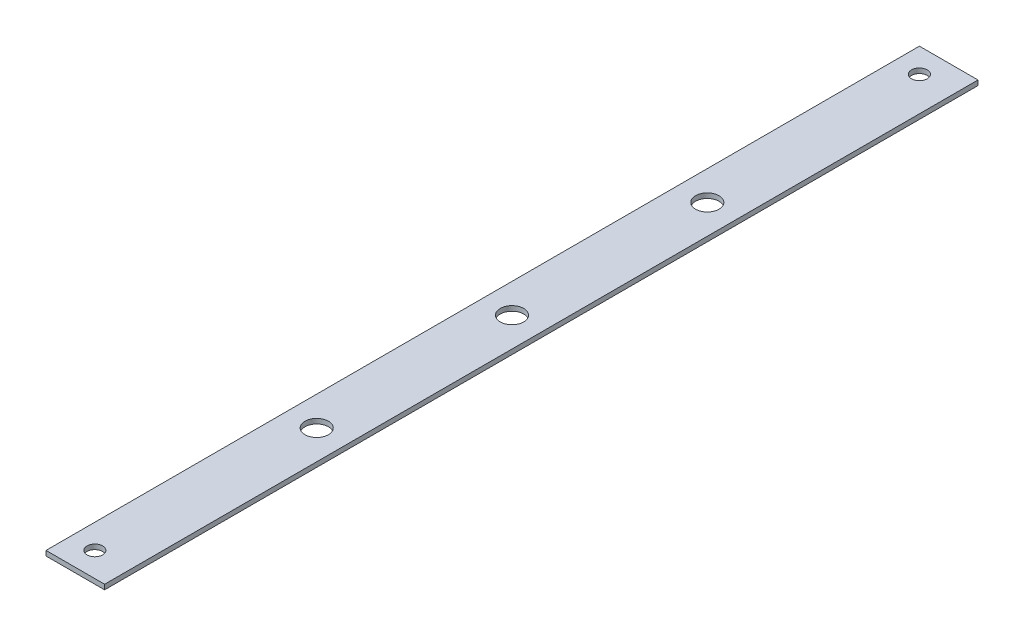
ISO-10303-21;
HEADER;
FILE_DESCRIPTION(('STEP AP214'),'2;1');
FILE_NAME('part.step','',(''),(''),'','','');
FILE_SCHEMA(('AUTOMOTIVE_DESIGN { 1 0 10303 214 1 1 1 1 }'));
ENDSEC;
DATA;
#1=APPLICATION_CONTEXT('core data for automotive mechanical design processes');
#2=APPLICATION_PROTOCOL_DEFINITION('international standard','automotive_design',2000,#1);
#3=PRODUCT_CONTEXT('',#1,'mechanical');
#4=PRODUCT('Part','Part','',(#3));
#5=PRODUCT_RELATED_PRODUCT_CATEGORY('part','',(#4));
#6=PRODUCT_DEFINITION_FORMATION('','',#4);
#7=PRODUCT_DEFINITION_CONTEXT('part definition',#1,'design');
#8=PRODUCT_DEFINITION('design','',#6,#7);
#9=PRODUCT_DEFINITION_SHAPE('','',#8);
#10=(LENGTH_UNIT() NAMED_UNIT(*) SI_UNIT(.MILLI.,.METRE.));
#11=(NAMED_UNIT(*) PLANE_ANGLE_UNIT() SI_UNIT($,.RADIAN.));
#12=(NAMED_UNIT(*) SI_UNIT($,.STERADIAN.) SOLID_ANGLE_UNIT());
#13=UNCERTAINTY_MEASURE_WITH_UNIT(LENGTH_MEASURE(1.E-05),#10,'distance_accuracy_value','');
#14=(GEOMETRIC_REPRESENTATION_CONTEXT(3) GLOBAL_UNCERTAINTY_ASSIGNED_CONTEXT((#13)) GLOBAL_UNIT_ASSIGNED_CONTEXT((#10,
#11,#12)) REPRESENTATION_CONTEXT('',''));
#15=CARTESIAN_POINT('',(0.,0.,0.));
#16=DIRECTION('',(0.,0.,1.));
#17=DIRECTION('',(1.,0.,0.));
#18=AXIS2_PLACEMENT_3D('',#15,#16,#17);
#19=CARTESIAN_POINT('',(30.,0.,223.6));
#20=DIRECTION('',(0.,1.,0.));
#21=DIRECTION('',(-1.,0.,0.));
#22=AXIS2_PLACEMENT_3D('',#19,#20,#21);
#23=PLANE('',#22);
#24=CARTESIAN_POINT('',(15.,0.,0.));
#25=DIRECTION('',(0.,1.,0.));
#26=DIRECTION('',(-1.,0.,0.));
#27=AXIS2_PLACEMENT_3D('',#24,#25,#26);
#28=CIRCLE('',#27,6.);
#29=CARTESIAN_POINT('',(9.,0.,0.));
#30=VERTEX_POINT('',#29);
#31=EDGE_CURVE('E130',#30,#30,#28,.T.);
#32=ORIENTED_EDGE('',*,*,#31,.T.);
#33=EDGE_LOOP('',(#32));
#34=FACE_BOUND('',#33,.T.);
#35=CARTESIAN_POINT('',(15.0000000000001,0.,-100.));
#36=DIRECTION('',(0.,1.,0.));
#37=DIRECTION('',(1.,0.,0.));
#38=AXIS2_PLACEMENT_3D('',#35,#36,#37);
#39=CIRCLE('',#38,6.00000000000001);
#40=CARTESIAN_POINT('',(21.0000000000001,0.,-100.));
#41=VERTEX_POINT('',#40);
#42=EDGE_CURVE('E124',#41,#41,#39,.T.);
#43=ORIENTED_EDGE('',*,*,#42,.T.);
#44=EDGE_LOOP('',(#43));
#45=FACE_BOUND('',#44,.T.);
#46=CARTESIAN_POINT('',(15.,0.,100.));
#47=DIRECTION('',(0.,1.,0.));
#48=DIRECTION('',(-1.,0.,0.));
#49=AXIS2_PLACEMENT_3D('',#46,#47,#48);
#50=CIRCLE('',#49,6.00000000000001);
#51=CARTESIAN_POINT('',(8.99999999999999,0.,100.));
#52=VERTEX_POINT('',#51);
#53=EDGE_CURVE('E118',#52,#52,#50,.T.);
#54=ORIENTED_EDGE('',*,*,#53,.T.);
#55=EDGE_LOOP('',(#54));
#56=FACE_BOUND('',#55,.T.);
#57=CARTESIAN_POINT('',(12.5,0.,211.1));
#58=DIRECTION('',(0.,1.,0.));
#59=DIRECTION('',(1.,0.,0.));
#60=AXIS2_PLACEMENT_3D('',#57,#58,#59);
#61=CIRCLE('',#60,4.);
#62=CARTESIAN_POINT('',(16.5,0.,211.1));
#63=VERTEX_POINT('',#62);
#64=EDGE_CURVE('E112',#63,#63,#61,.T.);
#65=ORIENTED_EDGE('',*,*,#64,.T.);
#66=EDGE_LOOP('',(#65));
#67=FACE_BOUND('',#66,.T.);
#68=CARTESIAN_POINT('',(12.5,0.,-211.1));
#69=DIRECTION('',(0.,1.,0.));
#70=DIRECTION('',(-1.,0.,0.));
#71=AXIS2_PLACEMENT_3D('',#68,#69,#70);
#72=CIRCLE('',#71,4.);
#73=CARTESIAN_POINT('',(8.5,0.,-211.1));
#74=VERTEX_POINT('',#73);
#75=EDGE_CURVE('E98',#74,#74,#72,.T.);
#76=ORIENTED_EDGE('',*,*,#75,.T.);
#77=EDGE_LOOP('',(#76));
#78=FACE_BOUND('',#77,.T.);
#79=DIRECTION('',(1.,0.,0.));
#80=VECTOR('',#79,1.);
#81=CARTESIAN_POINT('',(30.,0.,-223.6));
#82=LINE('',#81,#80);
#83=CARTESIAN_POINT('',(0.,0.,-223.6));
#84=VERTEX_POINT('',#83);
#85=CARTESIAN_POINT('',(30.,0.,-223.6));
#86=VERTEX_POINT('',#85);
#87=EDGE_CURVE('E95',#84,#86,#82,.T.);
#88=ORIENTED_EDGE('',*,*,#87,.T.);
#89=DIRECTION('',(0.,0.,-1.));
#90=VECTOR('',#89,1.);
#91=CARTESIAN_POINT('',(30.,0.,223.6));
#92=LINE('',#91,#90);
#93=CARTESIAN_POINT('',(30.,0.,223.6));
#94=VERTEX_POINT('',#93);
#95=EDGE_CURVE('E11',#94,#86,#92,.T.);
#96=ORIENTED_EDGE('',*,*,#95,.F.);
#97=DIRECTION('',(1.,0.,0.));
#98=VECTOR('',#97,1.);
#99=CARTESIAN_POINT('',(30.,0.,223.6));
#100=LINE('',#99,#98);
#101=CARTESIAN_POINT('',(0.,0.,223.6));
#102=VERTEX_POINT('',#101);
#103=EDGE_CURVE('E82',#102,#94,#100,.T.);
#104=ORIENTED_EDGE('',*,*,#103,.F.);
#105=DIRECTION('',(0.,0.,-1.));
#106=VECTOR('',#105,1.);
#107=CARTESIAN_POINT('',(0.,0.,223.6));
#108=LINE('',#107,#106);
#109=EDGE_CURVE('E91',#102,#84,#108,.T.);
#110=ORIENTED_EDGE('',*,*,#109,.T.);
#111=EDGE_LOOP('',(#88,#96,#104,#110));
#112=FACE_BOUND('',#111,.T.);
#113=ADVANCED_FACE('F32',(#34,#45,#56,#67,#78,#112),#23,.F.);
#114=CARTESIAN_POINT('',(30.,2.5,223.6));
#115=DIRECTION('',(-1.,0.,0.));
#116=DIRECTION('',(0.,0.,1.));
#117=AXIS2_PLACEMENT_3D('',#114,#115,#116);
#118=PLANE('',#117);
#119=DIRECTION('',(0.,1.,0.));
#120=VECTOR('',#119,1.);
#121=CARTESIAN_POINT('',(30.,2.5,-223.6));
#122=LINE('',#121,#120);
#123=CARTESIAN_POINT('',(30.,2.5,-223.6));
#124=VERTEX_POINT('',#123);
#125=EDGE_CURVE('E87',#86,#124,#122,.T.);
#126=ORIENTED_EDGE('',*,*,#125,.T.);
#127=DIRECTION('',(0.,0.,-1.));
#128=VECTOR('',#127,1.);
#129=CARTESIAN_POINT('',(30.,2.5,223.6));
#130=LINE('',#129,#128);
#131=CARTESIAN_POINT('',(30.,2.5,223.6));
#132=VERTEX_POINT('',#131);
#133=EDGE_CURVE('E40',#132,#124,#130,.T.);
#134=ORIENTED_EDGE('',*,*,#133,.F.);
#135=DIRECTION('',(0.,1.,0.));
#136=VECTOR('',#135,1.);
#137=CARTESIAN_POINT('',(30.,2.5,223.6));
#138=LINE('',#137,#136);
#139=EDGE_CURVE('E77',#94,#132,#138,.T.);
#140=ORIENTED_EDGE('',*,*,#139,.F.);
#141=ORIENTED_EDGE('',*,*,#95,.T.);
#142=EDGE_LOOP('',(#126,#134,#140,#141));
#143=FACE_BOUND('',#142,.T.);
#144=ADVANCED_FACE('F86',(#143),#118,.F.);
#145=CARTESIAN_POINT('',(2.5,2.5,223.6));
#146=DIRECTION('',(0.,-1.,0.));
#147=DIRECTION('',(0.,0.,-1.));
#148=AXIS2_PLACEMENT_3D('',#145,#146,#147);
#149=PLANE('',#148);
#150=CARTESIAN_POINT('',(15.,2.5,0.));
#151=DIRECTION('',(0.,1.,0.));
#152=DIRECTION('',(-1.,0.,0.));
#153=AXIS2_PLACEMENT_3D('',#150,#151,#152);
#154=CIRCLE('',#153,6.);
#155=CARTESIAN_POINT('',(9.,2.5,0.));
#156=VERTEX_POINT('',#155);
#157=EDGE_CURVE('E133',#156,#156,#154,.T.);
#158=ORIENTED_EDGE('',*,*,#157,.F.);
#159=EDGE_LOOP('',(#158));
#160=FACE_BOUND('',#159,.T.);
#161=CARTESIAN_POINT('',(15.0000000000001,2.5,-100.));
#162=DIRECTION('',(0.,1.,0.));
#163=DIRECTION('',(1.,0.,0.));
#164=AXIS2_PLACEMENT_3D('',#161,#162,#163);
#165=CIRCLE('',#164,6.00000000000001);
#166=CARTESIAN_POINT('',(21.0000000000001,2.5,-100.));
#167=VERTEX_POINT('',#166);
#168=EDGE_CURVE('E127',#167,#167,#165,.T.);
#169=ORIENTED_EDGE('',*,*,#168,.F.);
#170=EDGE_LOOP('',(#169));
#171=FACE_BOUND('',#170,.T.);
#172=CARTESIAN_POINT('',(15.,2.5,100.));
#173=DIRECTION('',(0.,1.,0.));
#174=DIRECTION('',(-1.,0.,0.));
#175=AXIS2_PLACEMENT_3D('',#172,#173,#174);
#176=CIRCLE('',#175,6.00000000000001);
#177=CARTESIAN_POINT('',(8.99999999999999,2.5,100.));
#178=VERTEX_POINT('',#177);
#179=EDGE_CURVE('E121',#178,#178,#176,.T.);
#180=ORIENTED_EDGE('',*,*,#179,.F.);
#181=EDGE_LOOP('',(#180));
#182=FACE_BOUND('',#181,.T.);
#183=CARTESIAN_POINT('',(12.5,2.5,211.1));
#184=DIRECTION('',(0.,1.,0.));
#185=DIRECTION('',(1.,0.,0.));
#186=AXIS2_PLACEMENT_3D('',#183,#184,#185);
#187=CIRCLE('',#186,4.);
#188=CARTESIAN_POINT('',(16.5,2.5,211.1));
#189=VERTEX_POINT('',#188);
#190=EDGE_CURVE('E115',#189,#189,#187,.T.);
#191=ORIENTED_EDGE('',*,*,#190,.F.);
#192=EDGE_LOOP('',(#191));
#193=FACE_BOUND('',#192,.T.);
#194=CARTESIAN_POINT('',(12.5,2.5,-211.1));
#195=DIRECTION('',(0.,1.,0.));
#196=DIRECTION('',(-1.,0.,0.));
#197=AXIS2_PLACEMENT_3D('',#194,#195,#196);
#198=CIRCLE('',#197,4.);
#199=CARTESIAN_POINT('',(8.5,2.5,-211.1));
#200=VERTEX_POINT('',#199);
#201=EDGE_CURVE('E109',#200,#200,#198,.T.);
#202=ORIENTED_EDGE('',*,*,#201,.F.);
#203=EDGE_LOOP('',(#202));
#204=FACE_BOUND('',#203,.T.);
#205=DIRECTION('',(-1.,0.,0.));
#206=VECTOR('',#205,1.);
#207=CARTESIAN_POINT('',(2.5,2.5,-223.6));
#208=LINE('',#207,#206);
#209=CARTESIAN_POINT('',(0.,2.5,-223.6));
#210=VERTEX_POINT('',#209);
#211=EDGE_CURVE('E64',#124,#210,#208,.T.);
#212=ORIENTED_EDGE('',*,*,#211,.T.);
#213=DIRECTION('',(0.,0.,-1.));
#214=VECTOR('',#213,1.);
#215=CARTESIAN_POINT('',(0.,2.5,223.6));
#216=LINE('',#215,#214);
#217=CARTESIAN_POINT('',(0.,2.5,223.6));
#218=VERTEX_POINT('',#217);
#219=EDGE_CURVE('E88',#218,#210,#216,.T.);
#220=ORIENTED_EDGE('',*,*,#219,.F.);
#221=DIRECTION('',(-1.,0.,0.));
#222=VECTOR('',#221,1.);
#223=CARTESIAN_POINT('',(2.5,2.5,223.6));
#224=LINE('',#223,#222);
#225=EDGE_CURVE('E80',#132,#218,#224,.T.);
#226=ORIENTED_EDGE('',*,*,#225,.F.);
#227=ORIENTED_EDGE('',*,*,#133,.T.);
#228=EDGE_LOOP('',(#212,#220,#226,#227));
#229=FACE_BOUND('',#228,.T.);
#230=ADVANCED_FACE('F89',(#160,#171,#182,#193,#204,#229),#149,.F.);
#231=CARTESIAN_POINT('',(0.,2.5,223.6));
#232=DIRECTION('',(1.,0.,0.));
#233=DIRECTION('',(0.,0.,-1.));
#234=AXIS2_PLACEMENT_3D('',#231,#232,#233);
#235=PLANE('',#234);
#236=DIRECTION('',(0.,-1.,0.));
#237=VECTOR('',#236,1.);
#238=CARTESIAN_POINT('',(0.,2.5,-223.6));
#239=LINE('',#238,#237);
#240=EDGE_CURVE('E70',#210,#84,#239,.T.);
#241=ORIENTED_EDGE('',*,*,#240,.T.);
#242=ORIENTED_EDGE('',*,*,#109,.F.);
#243=DIRECTION('',(0.,-1.,0.));
#244=VECTOR('',#243,1.);
#245=CARTESIAN_POINT('',(0.,2.5,223.6));
#246=LINE('',#245,#244);
#247=EDGE_CURVE('E48',#218,#102,#246,.T.);
#248=ORIENTED_EDGE('',*,*,#247,.F.);
#249=ORIENTED_EDGE('',*,*,#219,.T.);
#250=EDGE_LOOP('',(#241,#242,#248,#249));
#251=FACE_BOUND('',#250,.T.);
#252=ADVANCED_FACE('F103',(#251),#235,.F.);
#253=CARTESIAN_POINT('',(0.,0.,223.6));
#254=DIRECTION('',(0.,0.,1.));
#255=DIRECTION('',(1.,0.,0.));
#256=AXIS2_PLACEMENT_3D('',#253,#254,#255);
#257=PLANE('',#256);
#258=ORIENTED_EDGE('',*,*,#103,.T.);
#259=ORIENTED_EDGE('',*,*,#139,.T.);
#260=ORIENTED_EDGE('',*,*,#225,.T.);
#261=ORIENTED_EDGE('',*,*,#247,.T.);
#262=EDGE_LOOP('',(#258,#259,#260,#261));
#263=FACE_BOUND('',#262,.T.);
#264=ADVANCED_FACE('F78',(#263),#257,.T.);
#265=CARTESIAN_POINT('',(0.,0.,-223.6));
#266=DIRECTION('',(0.,0.,1.));
#267=DIRECTION('',(1.,0.,0.));
#268=AXIS2_PLACEMENT_3D('',#265,#266,#267);
#269=PLANE('',#268);
#270=ORIENTED_EDGE('',*,*,#87,.F.);
#271=ORIENTED_EDGE('',*,*,#240,.F.);
#272=ORIENTED_EDGE('',*,*,#211,.F.);
#273=ORIENTED_EDGE('',*,*,#125,.F.);
#274=EDGE_LOOP('',(#270,#271,#272,#273));
#275=FACE_BOUND('',#274,.T.);
#276=ADVANCED_FACE('F106',(#275),#269,.F.);
#277=CARTESIAN_POINT('',(12.5,0.,-211.1));
#278=DIRECTION('',(0.,1.,0.));
#279=DIRECTION('',(-1.,0.,0.));
#280=AXIS2_PLACEMENT_3D('',#277,#278,#279);
#281=CYLINDRICAL_SURFACE('',#280,4.);
#282=ORIENTED_EDGE('',*,*,#75,.F.);
#283=EDGE_LOOP('',(#282));
#284=FACE_BOUND('',#283,.T.);
#285=ORIENTED_EDGE('',*,*,#201,.T.);
#286=EDGE_LOOP('',(#285));
#287=FACE_BOUND('',#286,.T.);
#288=ADVANCED_FACE('F159',(#284,#287),#281,.F.);
#289=CARTESIAN_POINT('',(12.5,0.,211.1));
#290=DIRECTION('',(0.,1.,0.));
#291=DIRECTION('',(-1.,0.,0.));
#292=AXIS2_PLACEMENT_3D('',#289,#290,#291);
#293=CYLINDRICAL_SURFACE('',#292,4.);
#294=ORIENTED_EDGE('',*,*,#64,.F.);
#295=EDGE_LOOP('',(#294));
#296=FACE_BOUND('',#295,.T.);
#297=ORIENTED_EDGE('',*,*,#190,.T.);
#298=EDGE_LOOP('',(#297));
#299=FACE_BOUND('',#298,.T.);
#300=ADVANCED_FACE('F161',(#296,#299),#293,.F.);
#301=CARTESIAN_POINT('',(15.,0.,100.));
#302=DIRECTION('',(0.,1.,0.));
#303=DIRECTION('',(-1.,0.,0.));
#304=AXIS2_PLACEMENT_3D('',#301,#302,#303);
#305=CYLINDRICAL_SURFACE('',#304,6.00000000000001);
#306=ORIENTED_EDGE('',*,*,#53,.F.);
#307=EDGE_LOOP('',(#306));
#308=FACE_BOUND('',#307,.T.);
#309=ORIENTED_EDGE('',*,*,#179,.T.);
#310=EDGE_LOOP('',(#309));
#311=FACE_BOUND('',#310,.T.);
#312=ADVANCED_FACE('F168',(#308,#311),#305,.F.);
#313=CARTESIAN_POINT('',(15.0000000000001,0.,-100.));
#314=DIRECTION('',(0.,1.,0.));
#315=DIRECTION('',(-1.,0.,0.));
#316=AXIS2_PLACEMENT_3D('',#313,#314,#315);
#317=CYLINDRICAL_SURFACE('',#316,6.00000000000001);
#318=ORIENTED_EDGE('',*,*,#42,.F.);
#319=EDGE_LOOP('',(#318));
#320=FACE_BOUND('',#319,.T.);
#321=ORIENTED_EDGE('',*,*,#168,.T.);
#322=EDGE_LOOP('',(#321));
#323=FACE_BOUND('',#322,.T.);
#324=ADVANCED_FACE('F144',(#320,#323),#317,.F.);
#325=CARTESIAN_POINT('',(15.,0.,0.));
#326=DIRECTION('',(0.,1.,0.));
#327=DIRECTION('',(-1.,0.,0.));
#328=AXIS2_PLACEMENT_3D('',#325,#326,#327);
#329=CYLINDRICAL_SURFACE('',#328,6.);
#330=ORIENTED_EDGE('',*,*,#31,.F.);
#331=EDGE_LOOP('',(#330));
#332=FACE_BOUND('',#331,.T.);
#333=ORIENTED_EDGE('',*,*,#157,.T.);
#334=EDGE_LOOP('',(#333));
#335=FACE_BOUND('',#334,.T.);
#336=ADVANCED_FACE('F141',(#332,#335),#329,.F.);
#337=CLOSED_SHELL('',(#113,#144,#230,#252,#264,#276,#288,#300,#312,#324,#336));
#338=MANIFOLD_SOLID_BREP('B2',#337);
#339=ADVANCED_BREP_SHAPE_REPRESENTATION('',(#18,#338),#14);
#340=SHAPE_DEFINITION_REPRESENTATION(#9,#339);
ENDSEC;
END-ISO-10303-21;
